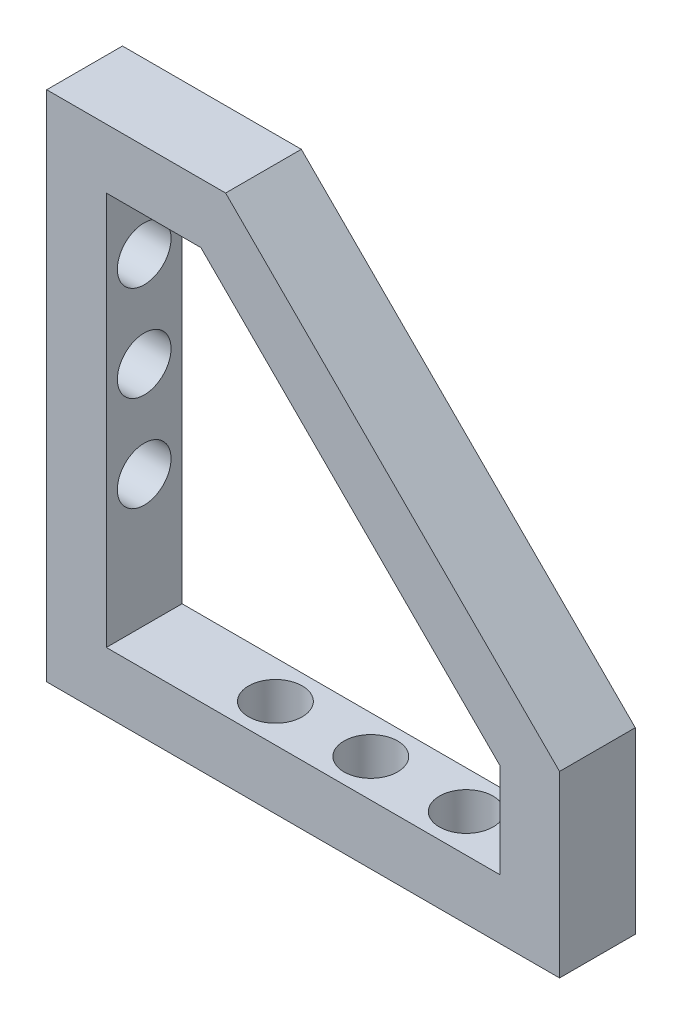
ISO-10303-21;
HEADER;
FILE_DESCRIPTION(('STEP AP214'),'2;1');
FILE_NAME('part.step','',(''),(''),'','','');
FILE_SCHEMA(('AUTOMOTIVE_DESIGN { 1 0 10303 214 1 1 1 1 }'));
ENDSEC;
DATA;
#1=APPLICATION_CONTEXT('core data for automotive mechanical design processes');
#2=APPLICATION_PROTOCOL_DEFINITION('international standard','automotive_design',2000,#1);
#3=PRODUCT_CONTEXT('',#1,'mechanical');
#4=PRODUCT('Part','Part','',(#3));
#5=PRODUCT_RELATED_PRODUCT_CATEGORY('part','',(#4));
#6=PRODUCT_DEFINITION_FORMATION('','',#4);
#7=PRODUCT_DEFINITION_CONTEXT('part definition',#1,'design');
#8=PRODUCT_DEFINITION('design','',#6,#7);
#9=PRODUCT_DEFINITION_SHAPE('','',#8);
#10=(LENGTH_UNIT() NAMED_UNIT(*) SI_UNIT(.MILLI.,.METRE.));
#11=(NAMED_UNIT(*) PLANE_ANGLE_UNIT() SI_UNIT($,.RADIAN.));
#12=(NAMED_UNIT(*) SI_UNIT($,.STERADIAN.) SOLID_ANGLE_UNIT());
#13=UNCERTAINTY_MEASURE_WITH_UNIT(LENGTH_MEASURE(1.E-05),#10,'distance_accuracy_value','');
#14=(GEOMETRIC_REPRESENTATION_CONTEXT(3) GLOBAL_UNCERTAINTY_ASSIGNED_CONTEXT((#13)) GLOBAL_UNIT_ASSIGNED_CONTEXT((#10,
#11,#12)) REPRESENTATION_CONTEXT('',''));
#15=CARTESIAN_POINT('',(0.,0.,0.));
#16=DIRECTION('',(0.,0.,1.));
#17=DIRECTION('',(1.,0.,0.));
#18=AXIS2_PLACEMENT_3D('',#15,#16,#17);
#19=CARTESIAN_POINT('',(0.,0.,6.35));
#20=DIRECTION('',(0.,0.,-1.));
#21=DIRECTION('',(-1.,0.,0.));
#22=AXIS2_PLACEMENT_3D('',#19,#20,#21);
#23=PLANE('',#22);
#24=DIRECTION('',(1.,0.,0.));
#25=VECTOR('',#24,1.);
#26=CARTESIAN_POINT('',(43.,0.,6.35));
#27=LINE('',#26,#25);
#28=CARTESIAN_POINT('',(0.,0.,6.35));
#29=VERTEX_POINT('',#28);
#30=CARTESIAN_POINT('',(43.,0.,6.35));
#31=VERTEX_POINT('',#30);
#32=EDGE_CURVE('E184',#29,#31,#27,.T.);
#33=ORIENTED_EDGE('',*,*,#32,.T.);
#34=DIRECTION('',(0.,1.,0.));
#35=VECTOR('',#34,1.);
#36=CARTESIAN_POINT('',(43.,15.,6.35));
#37=LINE('',#36,#35);
#38=CARTESIAN_POINT('',(43.,15.,6.35));
#39=VERTEX_POINT('',#38);
#40=EDGE_CURVE('E188',#31,#39,#37,.T.);
#41=ORIENTED_EDGE('',*,*,#40,.T.);
#42=DIRECTION('',(-0.707106781186547,0.707106781186548,0.));
#43=VECTOR('',#42,1.);
#44=CARTESIAN_POINT('',(15.,43.,6.35));
#45=LINE('',#44,#43);
#46=CARTESIAN_POINT('',(15.,43.,6.35));
#47=VERTEX_POINT('',#46);
#48=EDGE_CURVE('E192',#39,#47,#45,.T.);
#49=ORIENTED_EDGE('',*,*,#48,.T.);
#50=DIRECTION('',(-1.,0.,0.));
#51=VECTOR('',#50,1.);
#52=CARTESIAN_POINT('',(0.,43.,6.35));
#53=LINE('',#52,#51);
#54=CARTESIAN_POINT('',(0.,43.,6.35));
#55=VERTEX_POINT('',#54);
#56=EDGE_CURVE('E195',#47,#55,#53,.T.);
#57=ORIENTED_EDGE('',*,*,#56,.T.);
#58=DIRECTION('',(0.,-1.,0.));
#59=VECTOR('',#58,1.);
#60=CARTESIAN_POINT('',(0.,0.,6.35));
#61=LINE('',#60,#59);
#62=EDGE_CURVE('E198',#55,#29,#61,.T.);
#63=ORIENTED_EDGE('',*,*,#62,.T.);
#64=EDGE_LOOP('',(#33,#41,#49,#57,#63));
#65=FACE_BOUND('',#64,.T.);
#66=DIRECTION('',(0.,1.,0.));
#67=VECTOR('',#66,1.);
#68=CARTESIAN_POINT('',(38.,12.9289321881345,6.35));
#69=LINE('',#68,#67);
#70=CARTESIAN_POINT('',(38.,5.,6.35));
#71=VERTEX_POINT('',#70);
#72=CARTESIAN_POINT('',(38.,12.9289321881345,6.35));
#73=VERTEX_POINT('',#72);
#74=EDGE_CURVE('E123',#71,#73,#69,.T.);
#75=ORIENTED_EDGE('',*,*,#74,.F.);
#76=DIRECTION('',(1.,0.,0.));
#77=VECTOR('',#76,1.);
#78=CARTESIAN_POINT('',(38.,5.,6.35));
#79=LINE('',#78,#77);
#80=CARTESIAN_POINT('',(5.,5.,6.35));
#81=VERTEX_POINT('',#80);
#82=EDGE_CURVE('E156',#81,#71,#79,.T.);
#83=ORIENTED_EDGE('',*,*,#82,.F.);
#84=DIRECTION('',(0.,-1.,0.));
#85=VECTOR('',#84,1.);
#86=CARTESIAN_POINT('',(5.,5.,6.35));
#87=LINE('',#86,#85);
#88=CARTESIAN_POINT('',(5.,38.,6.35));
#89=VERTEX_POINT('',#88);
#90=EDGE_CURVE('E150',#89,#81,#87,.T.);
#91=ORIENTED_EDGE('',*,*,#90,.F.);
#92=DIRECTION('',(-1.,0.,0.));
#93=VECTOR('',#92,1.);
#94=CARTESIAN_POINT('',(5.,38.,6.35));
#95=LINE('',#94,#93);
#96=CARTESIAN_POINT('',(12.9289321881345,38.,6.35));
#97=VERTEX_POINT('',#96);
#98=EDGE_CURVE('E146',#97,#89,#95,.T.);
#99=ORIENTED_EDGE('',*,*,#98,.F.);
#100=DIRECTION('',(-0.707106781186547,0.707106781186548,0.));
#101=VECTOR('',#100,1.);
#102=CARTESIAN_POINT('',(12.9289321881345,38.,6.35));
#103=LINE('',#102,#101);
#104=EDGE_CURVE('E132',#73,#97,#103,.T.);
#105=ORIENTED_EDGE('',*,*,#104,.F.);
#106=EDGE_LOOP('',(#75,#83,#91,#99,#105));
#107=FACE_BOUND('',#106,.T.);
#108=ADVANCED_FACE('F45',(#65,#107),#23,.F.);
#109=CARTESIAN_POINT('',(0.,0.,0.));
#110=DIRECTION('',(0.,0.,-1.));
#111=DIRECTION('',(-1.,0.,0.));
#112=AXIS2_PLACEMENT_3D('',#109,#110,#111);
#113=PLANE('',#112);
#114=DIRECTION('',(1.,0.,0.));
#115=VECTOR('',#114,1.);
#116=CARTESIAN_POINT('',(43.,0.,0.));
#117=LINE('',#116,#115);
#118=CARTESIAN_POINT('',(0.,0.,0.));
#119=VERTEX_POINT('',#118);
#120=CARTESIAN_POINT('',(43.,0.,0.));
#121=VERTEX_POINT('',#120);
#122=EDGE_CURVE('E141',#119,#121,#117,.T.);
#123=ORIENTED_EDGE('',*,*,#122,.F.);
#124=DIRECTION('',(0.,-1.,0.));
#125=VECTOR('',#124,1.);
#126=CARTESIAN_POINT('',(0.,0.,0.));
#127=LINE('',#126,#125);
#128=CARTESIAN_POINT('',(0.,43.,0.));
#129=VERTEX_POINT('',#128);
#130=EDGE_CURVE('E189',#129,#119,#127,.T.);
#131=ORIENTED_EDGE('',*,*,#130,.F.);
#132=DIRECTION('',(-1.,0.,0.));
#133=VECTOR('',#132,1.);
#134=CARTESIAN_POINT('',(0.,43.,0.));
#135=LINE('',#134,#133);
#136=CARTESIAN_POINT('',(15.,43.,0.));
#137=VERTEX_POINT('',#136);
#138=EDGE_CURVE('E211',#137,#129,#135,.T.);
#139=ORIENTED_EDGE('',*,*,#138,.F.);
#140=DIRECTION('',(-0.707106781186547,0.707106781186548,0.));
#141=VECTOR('',#140,1.);
#142=CARTESIAN_POINT('',(15.,43.,0.));
#143=LINE('',#142,#141);
#144=CARTESIAN_POINT('',(43.,15.,0.));
#145=VERTEX_POINT('',#144);
#146=EDGE_CURVE('E208',#145,#137,#143,.T.);
#147=ORIENTED_EDGE('',*,*,#146,.F.);
#148=DIRECTION('',(0.,1.,0.));
#149=VECTOR('',#148,1.);
#150=CARTESIAN_POINT('',(43.,15.,0.));
#151=LINE('',#150,#149);
#152=EDGE_CURVE('E205',#121,#145,#151,.T.);
#153=ORIENTED_EDGE('',*,*,#152,.F.);
#154=EDGE_LOOP('',(#123,#131,#139,#147,#153));
#155=FACE_BOUND('',#154,.T.);
#156=DIRECTION('',(1.,0.,0.));
#157=VECTOR('',#156,1.);
#158=CARTESIAN_POINT('',(38.,5.,0.));
#159=LINE('',#158,#157);
#160=CARTESIAN_POINT('',(5.,5.,0.));
#161=VERTEX_POINT('',#160);
#162=CARTESIAN_POINT('',(38.,5.,0.));
#163=VERTEX_POINT('',#162);
#164=EDGE_CURVE('E133',#161,#163,#159,.T.);
#165=ORIENTED_EDGE('',*,*,#164,.T.);
#166=DIRECTION('',(0.,1.,0.));
#167=VECTOR('',#166,1.);
#168=CARTESIAN_POINT('',(38.,12.9289321881345,0.));
#169=LINE('',#168,#167);
#170=CARTESIAN_POINT('',(38.,12.9289321881345,0.));
#171=VERTEX_POINT('',#170);
#172=EDGE_CURVE('E69',#163,#171,#169,.T.);
#173=ORIENTED_EDGE('',*,*,#172,.T.);
#174=DIRECTION('',(-0.707106781186547,0.707106781186548,0.));
#175=VECTOR('',#174,1.);
#176=CARTESIAN_POINT('',(12.9289321881345,38.,0.));
#177=LINE('',#176,#175);
#178=CARTESIAN_POINT('',(12.9289321881345,38.,0.));
#179=VERTEX_POINT('',#178);
#180=EDGE_CURVE('E139',#171,#179,#177,.T.);
#181=ORIENTED_EDGE('',*,*,#180,.T.);
#182=DIRECTION('',(-1.,0.,0.));
#183=VECTOR('',#182,1.);
#184=CARTESIAN_POINT('',(5.,38.,0.));
#185=LINE('',#184,#183);
#186=CARTESIAN_POINT('',(5.,38.,0.));
#187=VERTEX_POINT('',#186);
#188=EDGE_CURVE('E164',#179,#187,#185,.T.);
#189=ORIENTED_EDGE('',*,*,#188,.T.);
#190=DIRECTION('',(0.,-1.,0.));
#191=VECTOR('',#190,1.);
#192=CARTESIAN_POINT('',(5.,5.,0.));
#193=LINE('',#192,#191);
#194=EDGE_CURVE('E168',#187,#161,#193,.T.);
#195=ORIENTED_EDGE('',*,*,#194,.T.);
#196=EDGE_LOOP('',(#165,#173,#181,#189,#195));
#197=FACE_BOUND('',#196,.T.);
#198=ADVANCED_FACE('F238',(#155,#197),#113,.T.);
#199=CARTESIAN_POINT('',(43.,0.,6.35));
#200=DIRECTION('',(0.,1.,0.));
#201=DIRECTION('',(-1.,0.,0.));
#202=AXIS2_PLACEMENT_3D('',#199,#200,#201);
#203=PLANE('',#202);
#204=CARTESIAN_POINT('',(16.,0.,3.175));
#205=DIRECTION('',(0.,-1.,0.));
#206=DIRECTION('',(1.,0.,0.));
#207=AXIS2_PLACEMENT_3D('',#204,#205,#206);
#208=CIRCLE('',#207,2.25);
#209=CARTESIAN_POINT('',(18.25,0.,3.175));
#210=VERTEX_POINT('',#209);
#211=EDGE_CURVE('E424',#210,#210,#208,.T.);
#212=ORIENTED_EDGE('',*,*,#211,.F.);
#213=EDGE_LOOP('',(#212));
#214=FACE_BOUND('',#213,.T.);
#215=CARTESIAN_POINT('',(24.,0.,3.175));
#216=DIRECTION('',(0.,-1.,0.));
#217=DIRECTION('',(1.,0.,0.));
#218=AXIS2_PLACEMENT_3D('',#215,#216,#217);
#219=CIRCLE('',#218,2.25);
#220=CARTESIAN_POINT('',(26.25,0.,3.175));
#221=VERTEX_POINT('',#220);
#222=EDGE_CURVE('E428',#221,#221,#219,.T.);
#223=ORIENTED_EDGE('',*,*,#222,.F.);
#224=EDGE_LOOP('',(#223));
#225=FACE_BOUND('',#224,.T.);
#226=CARTESIAN_POINT('',(32.,0.,3.175));
#227=DIRECTION('',(0.,-1.,0.));
#228=DIRECTION('',(1.,0.,0.));
#229=AXIS2_PLACEMENT_3D('',#226,#227,#228);
#230=CIRCLE('',#229,2.25);
#231=CARTESIAN_POINT('',(34.25,0.,3.175));
#232=VERTEX_POINT('',#231);
#233=EDGE_CURVE('E404',#232,#232,#230,.T.);
#234=ORIENTED_EDGE('',*,*,#233,.F.);
#235=EDGE_LOOP('',(#234));
#236=FACE_BOUND('',#235,.T.);
#237=ORIENTED_EDGE('',*,*,#122,.T.);
#238=DIRECTION('',(0.,0.,-1.));
#239=VECTOR('',#238,1.);
#240=CARTESIAN_POINT('',(43.,0.,6.35));
#241=LINE('',#240,#239);
#242=EDGE_CURVE('E11',#31,#121,#241,.T.);
#243=ORIENTED_EDGE('',*,*,#242,.F.);
#244=ORIENTED_EDGE('',*,*,#32,.F.);
#245=DIRECTION('',(0.,0.,-1.));
#246=VECTOR('',#245,1.);
#247=CARTESIAN_POINT('',(0.,0.,6.35));
#248=LINE('',#247,#246);
#249=EDGE_CURVE('E201',#29,#119,#248,.T.);
#250=ORIENTED_EDGE('',*,*,#249,.T.);
#251=EDGE_LOOP('',(#237,#243,#244,#250));
#252=FACE_BOUND('',#251,.T.);
#253=ADVANCED_FACE('F47',(#214,#225,#236,#252),#203,.F.);
#254=CARTESIAN_POINT('',(43.,15.,6.35));
#255=DIRECTION('',(-1.,0.,0.));
#256=DIRECTION('',(0.,-1.,0.));
#257=AXIS2_PLACEMENT_3D('',#254,#255,#256);
#258=PLANE('',#257);
#259=ORIENTED_EDGE('',*,*,#152,.T.);
#260=DIRECTION('',(0.,0.,-1.));
#261=VECTOR('',#260,1.);
#262=CARTESIAN_POINT('',(43.,15.,6.35));
#263=LINE('',#262,#261);
#264=EDGE_CURVE('E54',#39,#145,#263,.T.);
#265=ORIENTED_EDGE('',*,*,#264,.F.);
#266=ORIENTED_EDGE('',*,*,#40,.F.);
#267=ORIENTED_EDGE('',*,*,#242,.T.);
#268=EDGE_LOOP('',(#259,#265,#266,#267));
#269=FACE_BOUND('',#268,.T.);
#270=ADVANCED_FACE('F252',(#269),#258,.F.);
#271=CARTESIAN_POINT('',(15.,43.,6.35));
#272=DIRECTION('',(-0.707106781186548,-0.707106781186547,0.));
#273=DIRECTION('',(0.707106781186547,-0.707106781186548,0.));
#274=AXIS2_PLACEMENT_3D('',#271,#272,#273);
#275=PLANE('',#274);
#276=ORIENTED_EDGE('',*,*,#146,.T.);
#277=DIRECTION('',(0.,0.,-1.));
#278=VECTOR('',#277,1.);
#279=CARTESIAN_POINT('',(15.,43.,6.35));
#280=LINE('',#279,#278);
#281=EDGE_CURVE('E223',#47,#137,#280,.T.);
#282=ORIENTED_EDGE('',*,*,#281,.F.);
#283=ORIENTED_EDGE('',*,*,#48,.F.);
#284=ORIENTED_EDGE('',*,*,#264,.T.);
#285=EDGE_LOOP('',(#276,#282,#283,#284));
#286=FACE_BOUND('',#285,.T.);
#287=ADVANCED_FACE('F232',(#286),#275,.F.);
#288=CARTESIAN_POINT('',(0.,43.,6.35));
#289=DIRECTION('',(0.,-1.,0.));
#290=DIRECTION('',(0.,0.,-1.));
#291=AXIS2_PLACEMENT_3D('',#288,#289,#290);
#292=PLANE('',#291);
#293=ORIENTED_EDGE('',*,*,#138,.T.);
#294=DIRECTION('',(0.,0.,-1.));
#295=VECTOR('',#294,1.);
#296=CARTESIAN_POINT('',(0.,43.,6.35));
#297=LINE('',#296,#295);
#298=EDGE_CURVE('E219',#55,#129,#297,.T.);
#299=ORIENTED_EDGE('',*,*,#298,.F.);
#300=ORIENTED_EDGE('',*,*,#56,.F.);
#301=ORIENTED_EDGE('',*,*,#281,.T.);
#302=EDGE_LOOP('',(#293,#299,#300,#301));
#303=FACE_BOUND('',#302,.T.);
#304=ADVANCED_FACE('F243',(#303),#292,.F.);
#305=CARTESIAN_POINT('',(0.,0.,6.35));
#306=DIRECTION('',(1.,0.,0.));
#307=DIRECTION('',(0.,0.,-1.));
#308=AXIS2_PLACEMENT_3D('',#305,#306,#307);
#309=PLANE('',#308);
#310=CARTESIAN_POINT('',(0.,16.,3.175));
#311=DIRECTION('',(-1.,0.,0.));
#312=DIRECTION('',(0.,0.,1.));
#313=AXIS2_PLACEMENT_3D('',#310,#311,#312);
#314=CIRCLE('',#313,2.25);
#315=CARTESIAN_POINT('',(0.,16.,5.425));
#316=VERTEX_POINT('',#315);
#317=EDGE_CURVE('E394',#316,#316,#314,.T.);
#318=ORIENTED_EDGE('',*,*,#317,.F.);
#319=EDGE_LOOP('',(#318));
#320=FACE_BOUND('',#319,.T.);
#321=CARTESIAN_POINT('',(0.,24.,3.17499999999997));
#322=DIRECTION('',(-1.,0.,0.));
#323=DIRECTION('',(0.,0.,1.));
#324=AXIS2_PLACEMENT_3D('',#321,#322,#323);
#325=CIRCLE('',#324,2.25);
#326=CARTESIAN_POINT('',(0.,24.,5.42499999999997));
#327=VERTEX_POINT('',#326);
#328=EDGE_CURVE('E406',#327,#327,#325,.T.);
#329=ORIENTED_EDGE('',*,*,#328,.F.);
#330=EDGE_LOOP('',(#329));
#331=FACE_BOUND('',#330,.T.);
#332=CARTESIAN_POINT('',(0.,32.,3.17499999999994));
#333=DIRECTION('',(-1.,0.,0.));
#334=DIRECTION('',(0.,0.,1.));
#335=AXIS2_PLACEMENT_3D('',#332,#333,#334);
#336=CIRCLE('',#335,2.25);
#337=CARTESIAN_POINT('',(0.,32.,5.42499999999995));
#338=VERTEX_POINT('',#337);
#339=EDGE_CURVE('E413',#338,#338,#336,.T.);
#340=ORIENTED_EDGE('',*,*,#339,.F.);
#341=EDGE_LOOP('',(#340));
#342=FACE_BOUND('',#341,.T.);
#343=ORIENTED_EDGE('',*,*,#130,.T.);
#344=ORIENTED_EDGE('',*,*,#249,.F.);
#345=ORIENTED_EDGE('',*,*,#62,.F.);
#346=ORIENTED_EDGE('',*,*,#298,.T.);
#347=EDGE_LOOP('',(#343,#344,#345,#346));
#348=FACE_BOUND('',#347,.T.);
#349=ADVANCED_FACE('F247',(#320,#331,#342,#348),#309,.F.);
#350=CARTESIAN_POINT('',(38.,12.9289321881345,6.35));
#351=DIRECTION('',(-1.,0.,0.));
#352=DIRECTION('',(0.,0.,1.));
#353=AXIS2_PLACEMENT_3D('',#350,#351,#352);
#354=PLANE('',#353);
#355=ORIENTED_EDGE('',*,*,#172,.F.);
#356=DIRECTION('',(0.,0.,-1.));
#357=VECTOR('',#356,1.);
#358=CARTESIAN_POINT('',(38.,5.,6.35));
#359=LINE('',#358,#357);
#360=EDGE_CURVE('E127',#71,#163,#359,.T.);
#361=ORIENTED_EDGE('',*,*,#360,.F.);
#362=ORIENTED_EDGE('',*,*,#74,.T.);
#363=DIRECTION('',(0.,0.,-1.));
#364=VECTOR('',#363,1.);
#365=CARTESIAN_POINT('',(38.,12.9289321881345,6.35));
#366=LINE('',#365,#364);
#367=EDGE_CURVE('E126',#73,#171,#366,.T.);
#368=ORIENTED_EDGE('',*,*,#367,.T.);
#369=EDGE_LOOP('',(#355,#361,#362,#368));
#370=FACE_BOUND('',#369,.T.);
#371=ADVANCED_FACE('F125',(#370),#354,.T.);
#372=CARTESIAN_POINT('',(12.9289321881345,38.,6.35));
#373=DIRECTION('',(-0.707106781186548,-0.707106781186547,0.));
#374=DIRECTION('',(0.707106781186547,-0.707106781186548,0.));
#375=AXIS2_PLACEMENT_3D('',#372,#373,#374);
#376=PLANE('',#375);
#377=ORIENTED_EDGE('',*,*,#180,.F.);
#378=ORIENTED_EDGE('',*,*,#367,.F.);
#379=ORIENTED_EDGE('',*,*,#104,.T.);
#380=DIRECTION('',(0.,0.,-1.));
#381=VECTOR('',#380,1.);
#382=CARTESIAN_POINT('',(12.9289321881345,38.,6.35));
#383=LINE('',#382,#381);
#384=EDGE_CURVE('E142',#97,#179,#383,.T.);
#385=ORIENTED_EDGE('',*,*,#384,.T.);
#386=EDGE_LOOP('',(#377,#378,#379,#385));
#387=FACE_BOUND('',#386,.T.);
#388=ADVANCED_FACE('F136',(#387),#376,.T.);
#389=CARTESIAN_POINT('',(5.,38.,6.35));
#390=DIRECTION('',(0.,-1.,0.));
#391=DIRECTION('',(0.,0.,-1.));
#392=AXIS2_PLACEMENT_3D('',#389,#390,#391);
#393=PLANE('',#392);
#394=ORIENTED_EDGE('',*,*,#188,.F.);
#395=ORIENTED_EDGE('',*,*,#384,.F.);
#396=ORIENTED_EDGE('',*,*,#98,.T.);
#397=DIRECTION('',(0.,0.,-1.));
#398=VECTOR('',#397,1.);
#399=CARTESIAN_POINT('',(5.,38.,6.35));
#400=LINE('',#399,#398);
#401=EDGE_CURVE('E179',#89,#187,#400,.T.);
#402=ORIENTED_EDGE('',*,*,#401,.T.);
#403=EDGE_LOOP('',(#394,#395,#396,#402));
#404=FACE_BOUND('',#403,.T.);
#405=ADVANCED_FACE('F300',(#404),#393,.T.);
#406=CARTESIAN_POINT('',(5.,5.,6.35));
#407=DIRECTION('',(1.,0.,0.));
#408=DIRECTION('',(0.,0.,-1.));
#409=AXIS2_PLACEMENT_3D('',#406,#407,#408);
#410=PLANE('',#409);
#411=CARTESIAN_POINT('',(5.,16.,3.175));
#412=DIRECTION('',(1.,0.,0.));
#413=DIRECTION('',(0.,0.,-1.));
#414=AXIS2_PLACEMENT_3D('',#411,#412,#413);
#415=CIRCLE('',#414,2.25);
#416=CARTESIAN_POINT('',(5.,16.,0.924999999999998));
#417=VERTEX_POINT('',#416);
#418=EDGE_CURVE('E397',#417,#417,#415,.F.);
#419=ORIENTED_EDGE('',*,*,#418,.T.);
#420=EDGE_LOOP('',(#419));
#421=FACE_BOUND('',#420,.T.);
#422=CARTESIAN_POINT('',(5.,24.,3.17499999999997));
#423=DIRECTION('',(1.,0.,0.));
#424=DIRECTION('',(0.,0.,-1.));
#425=AXIS2_PLACEMENT_3D('',#422,#423,#424);
#426=CIRCLE('',#425,2.25);
#427=CARTESIAN_POINT('',(5.,24.,0.924999999999971));
#428=VERTEX_POINT('',#427);
#429=EDGE_CURVE('E409',#428,#428,#426,.F.);
#430=ORIENTED_EDGE('',*,*,#429,.T.);
#431=EDGE_LOOP('',(#430));
#432=FACE_BOUND('',#431,.T.);
#433=CARTESIAN_POINT('',(5.,32.,3.17499999999994));
#434=DIRECTION('',(1.,0.,0.));
#435=DIRECTION('',(0.,0.,-1.));
#436=AXIS2_PLACEMENT_3D('',#433,#434,#435);
#437=CIRCLE('',#436,2.25);
#438=CARTESIAN_POINT('',(5.,32.,0.924999999999942));
#439=VERTEX_POINT('',#438);
#440=EDGE_CURVE('E417',#439,#439,#437,.F.);
#441=ORIENTED_EDGE('',*,*,#440,.T.);
#442=EDGE_LOOP('',(#441));
#443=FACE_BOUND('',#442,.T.);
#444=ORIENTED_EDGE('',*,*,#194,.F.);
#445=ORIENTED_EDGE('',*,*,#401,.F.);
#446=ORIENTED_EDGE('',*,*,#90,.T.);
#447=DIRECTION('',(0.,0.,-1.));
#448=VECTOR('',#447,1.);
#449=CARTESIAN_POINT('',(5.,5.,6.35));
#450=LINE('',#449,#448);
#451=EDGE_CURVE('E61',#81,#161,#450,.T.);
#452=ORIENTED_EDGE('',*,*,#451,.T.);
#453=EDGE_LOOP('',(#444,#445,#446,#452));
#454=FACE_BOUND('',#453,.T.);
#455=ADVANCED_FACE('F306',(#421,#432,#443,#454),#410,.T.);
#456=CARTESIAN_POINT('',(38.,5.,6.35));
#457=DIRECTION('',(0.,1.,0.));
#458=DIRECTION('',(-1.,0.,0.));
#459=AXIS2_PLACEMENT_3D('',#456,#457,#458);
#460=PLANE('',#459);
#461=CARTESIAN_POINT('',(16.,5.,3.175));
#462=DIRECTION('',(0.,1.,0.));
#463=DIRECTION('',(-1.,0.,0.));
#464=AXIS2_PLACEMENT_3D('',#461,#462,#463);
#465=CIRCLE('',#464,2.25);
#466=CARTESIAN_POINT('',(13.75,5.,3.175));
#467=VERTEX_POINT('',#466);
#468=EDGE_CURVE('E161',#467,#467,#465,.F.);
#469=ORIENTED_EDGE('',*,*,#468,.T.);
#470=EDGE_LOOP('',(#469));
#471=FACE_BOUND('',#470,.T.);
#472=CARTESIAN_POINT('',(24.,5.,3.175));
#473=DIRECTION('',(0.,1.,0.));
#474=DIRECTION('',(-1.,0.,0.));
#475=AXIS2_PLACEMENT_3D('',#472,#473,#474);
#476=CIRCLE('',#475,2.25);
#477=CARTESIAN_POINT('',(21.75,5.,3.175));
#478=VERTEX_POINT('',#477);
#479=EDGE_CURVE('E432',#478,#478,#476,.F.);
#480=ORIENTED_EDGE('',*,*,#479,.T.);
#481=EDGE_LOOP('',(#480));
#482=FACE_BOUND('',#481,.T.);
#483=CARTESIAN_POINT('',(32.,5.,3.175));
#484=DIRECTION('',(0.,1.,0.));
#485=DIRECTION('',(-1.,0.,0.));
#486=AXIS2_PLACEMENT_3D('',#483,#484,#485);
#487=CIRCLE('',#486,2.25);
#488=CARTESIAN_POINT('',(29.75,5.,3.175));
#489=VERTEX_POINT('',#488);
#490=EDGE_CURVE('E399',#489,#489,#487,.F.);
#491=ORIENTED_EDGE('',*,*,#490,.T.);
#492=EDGE_LOOP('',(#491));
#493=FACE_BOUND('',#492,.T.);
#494=ORIENTED_EDGE('',*,*,#164,.F.);
#495=ORIENTED_EDGE('',*,*,#451,.F.);
#496=ORIENTED_EDGE('',*,*,#82,.T.);
#497=ORIENTED_EDGE('',*,*,#360,.T.);
#498=EDGE_LOOP('',(#494,#495,#496,#497));
#499=FACE_BOUND('',#498,.T.);
#500=ADVANCED_FACE('F319',(#471,#482,#493,#499),#460,.T.);
#501=CARTESIAN_POINT('',(32.,11.3639610306789,3.175));
#502=DIRECTION('',(0.,-1.,0.));
#503=DIRECTION('',(1.,0.,0.));
#504=AXIS2_PLACEMENT_3D('',#501,#502,#503);
#505=CYLINDRICAL_SURFACE('',#504,2.25);
#506=ORIENTED_EDGE('',*,*,#233,.T.);
#507=EDGE_LOOP('',(#506));
#508=FACE_BOUND('',#507,.T.);
#509=ORIENTED_EDGE('',*,*,#490,.F.);
#510=EDGE_LOOP('',(#509));
#511=FACE_BOUND('',#510,.T.);
#512=ADVANCED_FACE('F329',(#508,#511),#505,.F.);
#513=CARTESIAN_POINT('',(24.,11.3639610306789,3.175));
#514=DIRECTION('',(0.,-1.,0.));
#515=DIRECTION('',(1.,0.,0.));
#516=AXIS2_PLACEMENT_3D('',#513,#514,#515);
#517=CYLINDRICAL_SURFACE('',#516,2.25);
#518=ORIENTED_EDGE('',*,*,#222,.T.);
#519=EDGE_LOOP('',(#518));
#520=FACE_BOUND('',#519,.T.);
#521=ORIENTED_EDGE('',*,*,#479,.F.);
#522=EDGE_LOOP('',(#521));
#523=FACE_BOUND('',#522,.T.);
#524=ADVANCED_FACE('F339',(#520,#523),#517,.F.);
#525=CARTESIAN_POINT('',(16.,11.3639610306789,3.175));
#526=DIRECTION('',(0.,-1.,0.));
#527=DIRECTION('',(1.,0.,0.));
#528=AXIS2_PLACEMENT_3D('',#525,#526,#527);
#529=CYLINDRICAL_SURFACE('',#528,2.25);
#530=ORIENTED_EDGE('',*,*,#211,.T.);
#531=EDGE_LOOP('',(#530));
#532=FACE_BOUND('',#531,.T.);
#533=ORIENTED_EDGE('',*,*,#468,.F.);
#534=EDGE_LOOP('',(#533));
#535=FACE_BOUND('',#534,.T.);
#536=ADVANCED_FACE('F349',(#532,#535),#529,.F.);
#537=CARTESIAN_POINT('',(11.3639610306789,32.,3.17499999999994));
#538=DIRECTION('',(-1.,0.,0.));
#539=DIRECTION('',(0.,0.,1.));
#540=AXIS2_PLACEMENT_3D('',#537,#538,#539);
#541=CYLINDRICAL_SURFACE('',#540,2.25);
#542=ORIENTED_EDGE('',*,*,#339,.T.);
#543=EDGE_LOOP('',(#542));
#544=FACE_BOUND('',#543,.T.);
#545=ORIENTED_EDGE('',*,*,#440,.F.);
#546=EDGE_LOOP('',(#545));
#547=FACE_BOUND('',#546,.T.);
#548=ADVANCED_FACE('F359',(#544,#547),#541,.F.);
#549=CARTESIAN_POINT('',(11.3639610306789,24.,3.17499999999997));
#550=DIRECTION('',(-1.,0.,0.));
#551=DIRECTION('',(0.,0.,1.));
#552=AXIS2_PLACEMENT_3D('',#549,#550,#551);
#553=CYLINDRICAL_SURFACE('',#552,2.25);
#554=ORIENTED_EDGE('',*,*,#328,.T.);
#555=EDGE_LOOP('',(#554));
#556=FACE_BOUND('',#555,.T.);
#557=ORIENTED_EDGE('',*,*,#429,.F.);
#558=EDGE_LOOP('',(#557));
#559=FACE_BOUND('',#558,.T.);
#560=ADVANCED_FACE('F368',(#556,#559),#553,.F.);
#561=CARTESIAN_POINT('',(11.3639610306789,16.,3.175));
#562=DIRECTION('',(-1.,0.,0.));
#563=DIRECTION('',(0.,0.,1.));
#564=AXIS2_PLACEMENT_3D('',#561,#562,#563);
#565=CYLINDRICAL_SURFACE('',#564,2.25);
#566=ORIENTED_EDGE('',*,*,#317,.T.);
#567=EDGE_LOOP('',(#566));
#568=FACE_BOUND('',#567,.T.);
#569=ORIENTED_EDGE('',*,*,#418,.F.);
#570=EDGE_LOOP('',(#569));
#571=FACE_BOUND('',#570,.T.);
#572=ADVANCED_FACE('F378',(#568,#571),#565,.F.);
#573=CLOSED_SHELL('',(#108,#198,#253,#270,#287,#304,#349,#371,#388,#405,#455,#500,#512,#524,
#536,#548,#560,#572));
#574=MANIFOLD_SOLID_BREP('B2',#573);
#575=ADVANCED_BREP_SHAPE_REPRESENTATION('',(#18,#574),#14);
#576=SHAPE_DEFINITION_REPRESENTATION(#9,#575);
ENDSEC;
END-ISO-10303-21;
